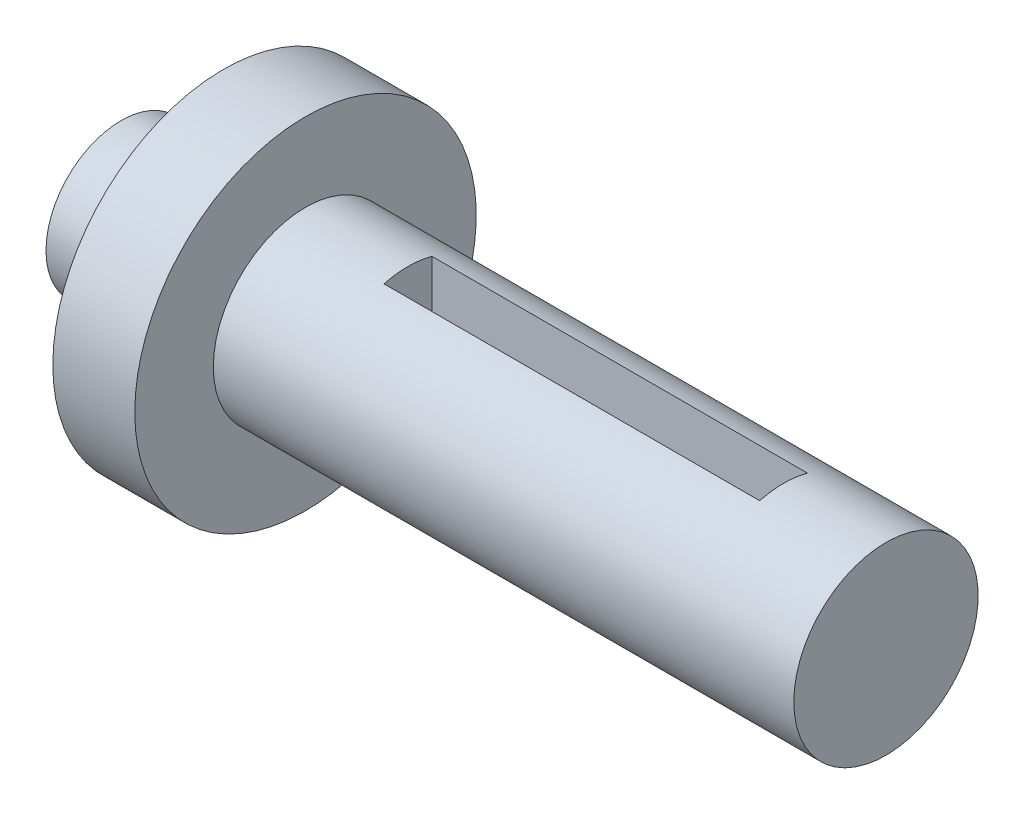
ISO-10303-21;
HEADER;
FILE_DESCRIPTION(('STEP AP214'),'2;1');
FILE_NAME('part.step','',(''),(''),'','','');
FILE_SCHEMA(('AUTOMOTIVE_DESIGN { 1 0 10303 214 1 1 1 1 }'));
ENDSEC;
DATA;
#1=APPLICATION_CONTEXT('core data for automotive mechanical design processes');
#2=APPLICATION_PROTOCOL_DEFINITION('international standard','automotive_design',2000,#1);
#3=PRODUCT_CONTEXT('',#1,'mechanical');
#4=PRODUCT('Part','Part','',(#3));
#5=PRODUCT_RELATED_PRODUCT_CATEGORY('part','',(#4));
#6=PRODUCT_DEFINITION_FORMATION('','',#4);
#7=PRODUCT_DEFINITION_CONTEXT('part definition',#1,'design');
#8=PRODUCT_DEFINITION('design','',#6,#7);
#9=PRODUCT_DEFINITION_SHAPE('','',#8);
#10=(LENGTH_UNIT() NAMED_UNIT(*) SI_UNIT(.MILLI.,.METRE.));
#11=(NAMED_UNIT(*) PLANE_ANGLE_UNIT() SI_UNIT($,.RADIAN.));
#12=(NAMED_UNIT(*) SI_UNIT($,.STERADIAN.) SOLID_ANGLE_UNIT());
#13=UNCERTAINTY_MEASURE_WITH_UNIT(LENGTH_MEASURE(1.E-05),#10,'distance_accuracy_value','');
#14=(GEOMETRIC_REPRESENTATION_CONTEXT(3) GLOBAL_UNCERTAINTY_ASSIGNED_CONTEXT((#13)) GLOBAL_UNIT_ASSIGNED_CONTEXT((#10,
#11,#12)) REPRESENTATION_CONTEXT('',''));
#15=CARTESIAN_POINT('',(0.,0.,0.));
#16=DIRECTION('',(0.,0.,1.));
#17=DIRECTION('',(1.,0.,0.));
#18=AXIS2_PLACEMENT_3D('',#15,#16,#17);
#19=CARTESIAN_POINT('',(0.,0.,-11.));
#20=DIRECTION('',(1.,0.,0.));
#21=DIRECTION('',(0.,0.,-1.));
#22=AXIS2_PLACEMENT_3D('',#19,#20,#21);
#23=PLANE('',#22);
#24=CARTESIAN_POINT('',(0.,0.,0.));
#25=DIRECTION('',(-1.,0.,0.));
#26=DIRECTION('',(0.,0.,1.));
#27=AXIS2_PLACEMENT_3D('',#24,#25,#26);
#28=CIRCLE('',#27,11.);
#29=CARTESIAN_POINT('',(0.,0.,11.));
#30=VERTEX_POINT('',#29);
#31=EDGE_CURVE('E135',#30,#30,#28,.T.);
#32=ORIENTED_EDGE('',*,*,#31,.T.);
#33=EDGE_LOOP('',(#32));
#34=FACE_BOUND('',#33,.T.);
#35=ADVANCED_FACE('F43',(#34),#23,.F.);
#36=CARTESIAN_POINT('',(112.,0.,0.));
#37=DIRECTION('',(-1.,0.,0.));
#38=DIRECTION('',(0.,0.,1.));
#39=AXIS2_PLACEMENT_3D('',#36,#37,#38);
#40=PLANE('',#39);
#41=CARTESIAN_POINT('',(112.,0.,0.));
#42=DIRECTION('',(-1.,0.,0.));
#43=DIRECTION('',(0.,0.,1.));
#44=AXIS2_PLACEMENT_3D('',#41,#42,#43);
#45=CIRCLE('',#44,13.5);
#46=CARTESIAN_POINT('',(112.,0.,13.5));
#47=VERTEX_POINT('',#46);
#48=EDGE_CURVE('E113',#47,#47,#45,.T.);
#49=ORIENTED_EDGE('',*,*,#48,.F.);
#50=EDGE_LOOP('',(#49));
#51=FACE_BOUND('',#50,.T.);
#52=ADVANCED_FACE('F155',(#51),#40,.F.);
#53=CARTESIAN_POINT('',(0.,0.,0.));
#54=DIRECTION('',(-1.,0.,0.));
#55=DIRECTION('',(0.,0.,1.));
#56=AXIS2_PLACEMENT_3D('',#53,#54,#55);
#57=CYLINDRICAL_SURFACE('',#56,13.5);
#58=DIRECTION('',(-1.,0.,0.));
#59=VECTOR('',#58,1.);
#60=CARTESIAN_POINT('',(0.,13.0384048104053,3.50000000000001));
#61=LINE('',#60,#59);
#62=CARTESIAN_POINT('',(97.,13.0384048104053,3.49999999999999));
#63=VERTEX_POINT('',#62);
#64=CARTESIAN_POINT('',(42.,13.0384048104053,3.50000000000001));
#65=VERTEX_POINT('',#64);
#66=EDGE_CURVE('E83',#63,#65,#61,.T.);
#67=ORIENTED_EDGE('',*,*,#66,.T.);
#68=CARTESIAN_POINT('',(42.,0.,0.));
#69=DIRECTION('',(-1.,0.,0.));
#70=DIRECTION('',(0.,0.,1.));
#71=AXIS2_PLACEMENT_3D('',#68,#69,#70);
#72=CIRCLE('',#71,13.5);
#73=CARTESIAN_POINT('',(42.,13.0384048104053,-3.5));
#74=VERTEX_POINT('',#73);
#75=EDGE_CURVE('E11',#65,#74,#72,.T.);
#76=ORIENTED_EDGE('',*,*,#75,.T.);
#77=DIRECTION('',(-1.,0.,0.));
#78=VECTOR('',#77,1.);
#79=CARTESIAN_POINT('',(0.,13.0384048104053,-3.49999999999999));
#80=LINE('',#79,#78);
#81=CARTESIAN_POINT('',(97.,13.0384048104053,-3.50000000000001));
#82=VERTEX_POINT('',#81);
#83=EDGE_CURVE('E46',#74,#82,#80,.F.);
#84=ORIENTED_EDGE('',*,*,#83,.T.);
#85=CARTESIAN_POINT('',(97.,0.,0.));
#86=DIRECTION('',(1.,0.,0.));
#87=DIRECTION('',(0.,0.,-1.));
#88=AXIS2_PLACEMENT_3D('',#85,#86,#87);
#89=CIRCLE('',#88,13.5);
#90=EDGE_CURVE('E88',#82,#63,#89,.T.);
#91=ORIENTED_EDGE('',*,*,#90,.T.);
#92=EDGE_LOOP('',(#67,#76,#84,#91));
#93=FACE_BOUND('',#92,.T.);
#94=DIRECTION('',(-1.,0.,0.));
#95=VECTOR('',#94,1.);
#96=CARTESIAN_POINT('',(0.,-13.0384048104053,-3.49999999999999));
#97=LINE('',#96,#95);
#98=CARTESIAN_POINT('',(97.,-13.0384048104053,-3.50000000000001));
#99=VERTEX_POINT('',#98);
#100=CARTESIAN_POINT('',(42.,-13.0384048104053,-3.5));
#101=VERTEX_POINT('',#100);
#102=EDGE_CURVE('E108',#99,#101,#97,.T.);
#103=ORIENTED_EDGE('',*,*,#102,.T.);
#104=CARTESIAN_POINT('',(42.,-13.0384048104053,3.5));
#105=VERTEX_POINT('',#104);
#106=EDGE_CURVE('E53',#101,#105,#72,.T.);
#107=ORIENTED_EDGE('',*,*,#106,.T.);
#108=DIRECTION('',(-1.,0.,0.));
#109=VECTOR('',#108,1.);
#110=CARTESIAN_POINT('',(0.,-13.0384048104053,3.50000000000001));
#111=LINE('',#110,#109);
#112=CARTESIAN_POINT('',(97.,-13.0384048104053,3.50000000000001));
#113=VERTEX_POINT('',#112);
#114=EDGE_CURVE('E109',#105,#113,#111,.F.);
#115=ORIENTED_EDGE('',*,*,#114,.T.);
#116=EDGE_CURVE('E94',#113,#99,#89,.T.);
#117=ORIENTED_EDGE('',*,*,#116,.T.);
#118=EDGE_LOOP('',(#103,#107,#115,#117));
#119=FACE_BOUND('',#118,.T.);
#120=CARTESIAN_POINT('',(27.,0.,0.));
#121=DIRECTION('',(-1.,0.,0.));
#122=DIRECTION('',(0.,0.,1.));
#123=AXIS2_PLACEMENT_3D('',#120,#121,#122);
#124=CIRCLE('',#123,13.5);
#125=CARTESIAN_POINT('',(27.,0.,13.5));
#126=VERTEX_POINT('',#125);
#127=EDGE_CURVE('E117',#126,#126,#124,.T.);
#128=ORIENTED_EDGE('',*,*,#127,.F.);
#129=EDGE_LOOP('',(#128));
#130=FACE_BOUND('',#129,.T.);
#131=ORIENTED_EDGE('',*,*,#48,.T.);
#132=EDGE_LOOP('',(#131));
#133=FACE_BOUND('',#132,.T.);
#134=ADVANCED_FACE('F100',(#93,#119,#130,#133),#57,.T.);
#135=CARTESIAN_POINT('',(27.,0.,-13.5));
#136=DIRECTION('',(-1.,0.,0.));
#137=DIRECTION('',(0.,0.,1.));
#138=AXIS2_PLACEMENT_3D('',#135,#136,#137);
#139=PLANE('',#138);
#140=CARTESIAN_POINT('',(27.,0.,0.));
#141=DIRECTION('',(-1.,0.,0.));
#142=DIRECTION('',(0.,0.,1.));
#143=AXIS2_PLACEMENT_3D('',#140,#141,#142);
#144=CIRCLE('',#143,25.);
#145=CARTESIAN_POINT('',(27.,0.,25.));
#146=VERTEX_POINT('',#145);
#147=EDGE_CURVE('E123',#146,#146,#144,.T.);
#148=ORIENTED_EDGE('',*,*,#147,.F.);
#149=EDGE_LOOP('',(#148));
#150=FACE_BOUND('',#149,.T.);
#151=ORIENTED_EDGE('',*,*,#127,.T.);
#152=EDGE_LOOP('',(#151));
#153=FACE_BOUND('',#152,.T.);
#154=ADVANCED_FACE('F154',(#150,#153),#139,.F.);
#155=CARTESIAN_POINT('',(0.,0.,0.));
#156=DIRECTION('',(-1.,0.,0.));
#157=DIRECTION('',(0.,0.,1.));
#158=AXIS2_PLACEMENT_3D('',#155,#156,#157);
#159=CYLINDRICAL_SURFACE('',#158,25.);
#160=CARTESIAN_POINT('',(15.,0.,0.));
#161=DIRECTION('',(-1.,0.,0.));
#162=DIRECTION('',(0.,0.,1.));
#163=AXIS2_PLACEMENT_3D('',#160,#161,#162);
#164=CIRCLE('',#163,25.);
#165=CARTESIAN_POINT('',(15.,0.,25.));
#166=VERTEX_POINT('',#165);
#167=EDGE_CURVE('E127',#166,#166,#164,.T.);
#168=ORIENTED_EDGE('',*,*,#167,.F.);
#169=EDGE_LOOP('',(#168));
#170=FACE_BOUND('',#169,.T.);
#171=ORIENTED_EDGE('',*,*,#147,.T.);
#172=EDGE_LOOP('',(#171));
#173=FACE_BOUND('',#172,.T.);
#174=ADVANCED_FACE('F169',(#170,#173),#159,.T.);
#175=CARTESIAN_POINT('',(15.,0.,-25.));
#176=DIRECTION('',(1.,0.,0.));
#177=DIRECTION('',(0.,0.,-1.));
#178=AXIS2_PLACEMENT_3D('',#175,#176,#177);
#179=PLANE('',#178);
#180=CARTESIAN_POINT('',(15.,0.,0.));
#181=DIRECTION('',(-1.,0.,0.));
#182=DIRECTION('',(0.,0.,1.));
#183=AXIS2_PLACEMENT_3D('',#180,#181,#182);
#184=CIRCLE('',#183,11.);
#185=CARTESIAN_POINT('',(15.,0.,11.));
#186=VERTEX_POINT('',#185);
#187=EDGE_CURVE('E131',#186,#186,#184,.T.);
#188=ORIENTED_EDGE('',*,*,#187,.F.);
#189=EDGE_LOOP('',(#188));
#190=FACE_BOUND('',#189,.T.);
#191=ORIENTED_EDGE('',*,*,#167,.T.);
#192=EDGE_LOOP('',(#191));
#193=FACE_BOUND('',#192,.T.);
#194=ADVANCED_FACE('F173',(#190,#193),#179,.F.);
#195=CARTESIAN_POINT('',(0.,0.,0.));
#196=DIRECTION('',(-1.,0.,0.));
#197=DIRECTION('',(0.,0.,1.));
#198=AXIS2_PLACEMENT_3D('',#195,#196,#197);
#199=CYLINDRICAL_SURFACE('',#198,11.);
#200=ORIENTED_EDGE('',*,*,#31,.F.);
#201=EDGE_LOOP('',(#200));
#202=FACE_BOUND('',#201,.T.);
#203=ORIENTED_EDGE('',*,*,#187,.T.);
#204=EDGE_LOOP('',(#203));
#205=FACE_BOUND('',#204,.T.);
#206=ADVANCED_FACE('F177',(#202,#205),#199,.T.);
#207=CARTESIAN_POINT('',(42.,-25.,3.5));
#208=DIRECTION('',(-1.,0.,0.));
#209=DIRECTION('',(0.,0.,1.));
#210=AXIS2_PLACEMENT_3D('',#207,#208,#209);
#211=PLANE('',#210);
#212=DIRECTION('',(0.,1.,0.));
#213=VECTOR('',#212,1.);
#214=CARTESIAN_POINT('',(42.,-25.,3.5));
#215=LINE('',#214,#213);
#216=EDGE_CURVE('E60',#105,#65,#215,.T.);
#217=ORIENTED_EDGE('',*,*,#216,.F.);
#218=ORIENTED_EDGE('',*,*,#106,.F.);
#219=DIRECTION('',(0.,1.,0.));
#220=VECTOR('',#219,1.);
#221=CARTESIAN_POINT('',(42.,-25.,-3.5));
#222=LINE('',#221,#220);
#223=EDGE_CURVE('E139',#101,#74,#222,.T.);
#224=ORIENTED_EDGE('',*,*,#223,.T.);
#225=ORIENTED_EDGE('',*,*,#75,.F.);
#226=EDGE_LOOP('',(#217,#218,#224,#225));
#227=FACE_BOUND('',#226,.T.);
#228=ADVANCED_FACE('F148',(#227),#211,.F.);
#229=CARTESIAN_POINT('',(97.,-25.,-3.50000000000001));
#230=DIRECTION('',(0.,0.,-1.));
#231=DIRECTION('',(-1.,0.,0.));
#232=AXIS2_PLACEMENT_3D('',#229,#230,#231);
#233=PLANE('',#232);
#234=DIRECTION('',(0.,1.,0.));
#235=VECTOR('',#234,1.);
#236=CARTESIAN_POINT('',(97.,-25.,-3.50000000000001));
#237=LINE('',#236,#235);
#238=EDGE_CURVE('E97',#99,#82,#237,.T.);
#239=ORIENTED_EDGE('',*,*,#238,.T.);
#240=ORIENTED_EDGE('',*,*,#83,.F.);
#241=ORIENTED_EDGE('',*,*,#223,.F.);
#242=ORIENTED_EDGE('',*,*,#102,.F.);
#243=EDGE_LOOP('',(#239,#240,#241,#242));
#244=FACE_BOUND('',#243,.T.);
#245=ADVANCED_FACE('F150',(#244),#233,.F.);
#246=CARTESIAN_POINT('',(97.,-25.,3.49999999999999));
#247=DIRECTION('',(1.,0.,0.));
#248=DIRECTION('',(0.,0.,-1.));
#249=AXIS2_PLACEMENT_3D('',#246,#247,#248);
#250=PLANE('',#249);
#251=ORIENTED_EDGE('',*,*,#238,.F.);
#252=ORIENTED_EDGE('',*,*,#116,.F.);
#253=DIRECTION('',(0.,1.,0.));
#254=VECTOR('',#253,1.);
#255=CARTESIAN_POINT('',(97.,-25.,3.49999999999999));
#256=LINE('',#255,#254);
#257=EDGE_CURVE('E65',#113,#63,#256,.T.);
#258=ORIENTED_EDGE('',*,*,#257,.T.);
#259=ORIENTED_EDGE('',*,*,#90,.F.);
#260=EDGE_LOOP('',(#251,#252,#258,#259));
#261=FACE_BOUND('',#260,.T.);
#262=ADVANCED_FACE('F91',(#261),#250,.F.);
#263=CARTESIAN_POINT('',(97.,-25.,3.49999999999999));
#264=DIRECTION('',(0.,0.,1.));
#265=DIRECTION('',(1.,0.,0.));
#266=AXIS2_PLACEMENT_3D('',#263,#264,#265);
#267=PLANE('',#266);
#268=ORIENTED_EDGE('',*,*,#257,.F.);
#269=ORIENTED_EDGE('',*,*,#114,.F.);
#270=ORIENTED_EDGE('',*,*,#216,.T.);
#271=ORIENTED_EDGE('',*,*,#66,.F.);
#272=EDGE_LOOP('',(#268,#269,#270,#271));
#273=FACE_BOUND('',#272,.T.);
#274=ADVANCED_FACE('F84',(#273),#267,.F.);
#275=CLOSED_SHELL('',(#35,#52,#134,#154,#174,#194,#206,#228,#245,#262,#274));
#276=MANIFOLD_SOLID_BREP('B2',#275);
#277=ADVANCED_BREP_SHAPE_REPRESENTATION('',(#18,#276),#14);
#278=SHAPE_DEFINITION_REPRESENTATION(#9,#277);
ENDSEC;
END-ISO-10303-21;
